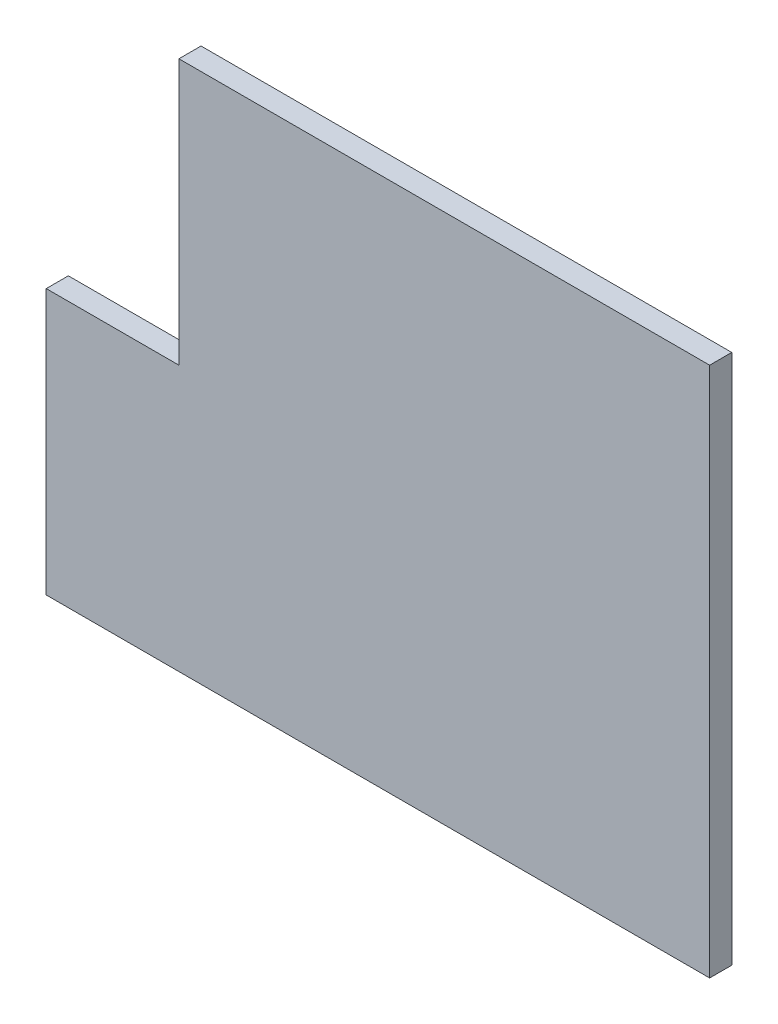
ISO-10303-21;
HEADER;
FILE_DESCRIPTION(('STEP AP214'),'2;1');
FILE_NAME('part.step','',(''),(''),'','','');
FILE_SCHEMA(('AUTOMOTIVE_DESIGN { 1 0 10303 214 1 1 1 1 }'));
ENDSEC;
DATA;
#1=APPLICATION_CONTEXT('core data for automotive mechanical design processes');
#2=APPLICATION_PROTOCOL_DEFINITION('international standard','automotive_design',2000,#1);
#3=PRODUCT_CONTEXT('',#1,'mechanical');
#4=PRODUCT('Part','Part','',(#3));
#5=PRODUCT_RELATED_PRODUCT_CATEGORY('part','',(#4));
#6=PRODUCT_DEFINITION_FORMATION('','',#4);
#7=PRODUCT_DEFINITION_CONTEXT('part definition',#1,'design');
#8=PRODUCT_DEFINITION('design','',#6,#7);
#9=PRODUCT_DEFINITION_SHAPE('','',#8);
#10=(LENGTH_UNIT() NAMED_UNIT(*) SI_UNIT(.MILLI.,.METRE.));
#11=(NAMED_UNIT(*) PLANE_ANGLE_UNIT() SI_UNIT($,.RADIAN.));
#12=(NAMED_UNIT(*) SI_UNIT($,.STERADIAN.) SOLID_ANGLE_UNIT());
#13=UNCERTAINTY_MEASURE_WITH_UNIT(LENGTH_MEASURE(1.E-05),#10,'distance_accuracy_value','');
#14=(GEOMETRIC_REPRESENTATION_CONTEXT(3) GLOBAL_UNCERTAINTY_ASSIGNED_CONTEXT((#13)) GLOBAL_UNIT_ASSIGNED_CONTEXT((#10,
#11,#12)) REPRESENTATION_CONTEXT('',''));
#15=CARTESIAN_POINT('',(0.,0.,0.));
#16=DIRECTION('',(0.,0.,1.));
#17=DIRECTION('',(1.,0.,0.));
#18=AXIS2_PLACEMENT_3D('',#15,#16,#17);
#19=CARTESIAN_POINT('',(47.625,-38.1,1.5875));
#20=DIRECTION('',(-1.,0.,0.));
#21=DIRECTION('',(0.,0.,1.));
#22=AXIS2_PLACEMENT_3D('',#19,#20,#21);
#23=PLANE('',#22);
#24=DIRECTION('',(0.,1.,0.));
#25=VECTOR('',#24,1.);
#26=CARTESIAN_POINT('',(47.625,-38.1,-1.5875));
#27=LINE('',#26,#25);
#28=CARTESIAN_POINT('',(47.625,-38.1,-1.5875));
#29=VERTEX_POINT('',#28);
#30=CARTESIAN_POINT('',(47.625,38.1,-1.5875));
#31=VERTEX_POINT('',#30);
#32=EDGE_CURVE('E134',#29,#31,#27,.T.);
#33=ORIENTED_EDGE('',*,*,#32,.T.);
#34=DIRECTION('',(0.,0.,-1.));
#35=VECTOR('',#34,1.);
#36=CARTESIAN_POINT('',(47.625,38.1,1.5875));
#37=LINE('',#36,#35);
#38=CARTESIAN_POINT('',(47.625,38.1,1.5875));
#39=VERTEX_POINT('',#38);
#40=EDGE_CURVE('E11',#39,#31,#37,.T.);
#41=ORIENTED_EDGE('',*,*,#40,.F.);
#42=DIRECTION('',(0.,1.,0.));
#43=VECTOR('',#42,1.);
#44=CARTESIAN_POINT('',(47.625,-38.1,1.5875));
#45=LINE('',#44,#43);
#46=CARTESIAN_POINT('',(47.625,-38.1,1.5875));
#47=VERTEX_POINT('',#46);
#48=EDGE_CURVE('E136',#47,#39,#45,.T.);
#49=ORIENTED_EDGE('',*,*,#48,.F.);
#50=DIRECTION('',(0.,0.,-1.));
#51=VECTOR('',#50,1.);
#52=CARTESIAN_POINT('',(47.625,-38.1,1.5875));
#53=LINE('',#52,#51);
#54=EDGE_CURVE('E144',#47,#29,#53,.T.);
#55=ORIENTED_EDGE('',*,*,#54,.T.);
#56=EDGE_LOOP('',(#33,#41,#49,#55));
#57=FACE_BOUND('',#56,.T.);
#58=ADVANCED_FACE('F40',(#57),#23,.F.);
#59=CARTESIAN_POINT('',(-47.625,38.1,1.5875));
#60=DIRECTION('',(0.,-1.,0.));
#61=DIRECTION('',(0.,0.,-1.));
#62=AXIS2_PLACEMENT_3D('',#59,#60,#61);
#63=PLANE('',#62);
#64=DIRECTION('',(-1.,0.,0.));
#65=VECTOR('',#64,1.);
#66=CARTESIAN_POINT('',(-47.625,38.1,-1.5875));
#67=LINE('',#66,#65);
#68=CARTESIAN_POINT('',(-28.575,38.1,-1.5875));
#69=VERTEX_POINT('',#68);
#70=EDGE_CURVE('E147',#31,#69,#67,.T.);
#71=ORIENTED_EDGE('',*,*,#70,.T.);
#72=DIRECTION('',(0.,0.,1.));
#73=VECTOR('',#72,1.);
#74=CARTESIAN_POINT('',(-28.575,38.1,-1.5875));
#75=LINE('',#74,#73);
#76=CARTESIAN_POINT('',(-28.575,38.1,1.5875));
#77=VERTEX_POINT('',#76);
#78=EDGE_CURVE('E114',#69,#77,#75,.T.);
#79=ORIENTED_EDGE('',*,*,#78,.T.);
#80=DIRECTION('',(-1.,0.,0.));
#81=VECTOR('',#80,1.);
#82=CARTESIAN_POINT('',(-47.625,38.1,1.5875));
#83=LINE('',#82,#81);
#84=EDGE_CURVE('E86',#39,#77,#83,.T.);
#85=ORIENTED_EDGE('',*,*,#84,.F.);
#86=ORIENTED_EDGE('',*,*,#40,.T.);
#87=EDGE_LOOP('',(#71,#79,#85,#86));
#88=FACE_BOUND('',#87,.T.);
#89=ADVANCED_FACE('F163',(#88),#63,.F.);
#90=CARTESIAN_POINT('',(-47.625,-38.1,1.5875));
#91=DIRECTION('',(1.,0.,0.));
#92=DIRECTION('',(0.,0.,-1.));
#93=AXIS2_PLACEMENT_3D('',#90,#91,#92);
#94=PLANE('',#93);
#95=DIRECTION('',(0.,-1.,0.));
#96=VECTOR('',#95,1.);
#97=CARTESIAN_POINT('',(-47.625,-38.1,1.5875));
#98=LINE('',#97,#96);
#99=CARTESIAN_POINT('',(-47.625,0.,1.5875));
#100=VERTEX_POINT('',#99);
#101=CARTESIAN_POINT('',(-47.625,-38.1,1.5875));
#102=VERTEX_POINT('',#101);
#103=EDGE_CURVE('E139',#100,#102,#98,.T.);
#104=ORIENTED_EDGE('',*,*,#103,.F.);
#105=DIRECTION('',(0.,0.,1.));
#106=VECTOR('',#105,1.);
#107=CARTESIAN_POINT('',(-47.625,0.,-1.5875));
#108=LINE('',#107,#106);
#109=CARTESIAN_POINT('',(-47.625,0.,-1.5875));
#110=VERTEX_POINT('',#109);
#111=EDGE_CURVE('E132',#110,#100,#108,.T.);
#112=ORIENTED_EDGE('',*,*,#111,.F.);
#113=DIRECTION('',(0.,-1.,0.));
#114=VECTOR('',#113,1.);
#115=CARTESIAN_POINT('',(-47.625,-38.1,-1.5875));
#116=LINE('',#115,#114);
#117=CARTESIAN_POINT('',(-47.625,-38.1,-1.5875));
#118=VERTEX_POINT('',#117);
#119=EDGE_CURVE('E122',#110,#118,#116,.T.);
#120=ORIENTED_EDGE('',*,*,#119,.T.);
#121=DIRECTION('',(0.,0.,-1.));
#122=VECTOR('',#121,1.);
#123=CARTESIAN_POINT('',(-47.625,-38.1,1.5875));
#124=LINE('',#123,#122);
#125=EDGE_CURVE('E47',#102,#118,#124,.T.);
#126=ORIENTED_EDGE('',*,*,#125,.F.);
#127=EDGE_LOOP('',(#104,#112,#120,#126));
#128=FACE_BOUND('',#127,.T.);
#129=ADVANCED_FACE('F159',(#128),#94,.F.);
#130=CARTESIAN_POINT('',(-47.625,-38.1,1.5875));
#131=DIRECTION('',(0.,1.,0.));
#132=DIRECTION('',(0.,0.,1.));
#133=AXIS2_PLACEMENT_3D('',#130,#131,#132);
#134=PLANE('',#133);
#135=DIRECTION('',(1.,0.,0.));
#136=VECTOR('',#135,1.);
#137=CARTESIAN_POINT('',(-47.625,-38.1,-1.5875));
#138=LINE('',#137,#136);
#139=EDGE_CURVE('E80',#118,#29,#138,.T.);
#140=ORIENTED_EDGE('',*,*,#139,.T.);
#141=ORIENTED_EDGE('',*,*,#54,.F.);
#142=DIRECTION('',(1.,0.,0.));
#143=VECTOR('',#142,1.);
#144=CARTESIAN_POINT('',(-47.625,-38.1,1.5875));
#145=LINE('',#144,#143);
#146=EDGE_CURVE('E63',#102,#47,#145,.T.);
#147=ORIENTED_EDGE('',*,*,#146,.F.);
#148=ORIENTED_EDGE('',*,*,#125,.T.);
#149=EDGE_LOOP('',(#140,#141,#147,#148));
#150=FACE_BOUND('',#149,.T.);
#151=ADVANCED_FACE('F156',(#150),#134,.F.);
#152=CARTESIAN_POINT('',(0.,0.,1.5875));
#153=DIRECTION('',(0.,0.,-1.));
#154=DIRECTION('',(-1.,0.,0.));
#155=AXIS2_PLACEMENT_3D('',#152,#153,#154);
#156=PLANE('',#155);
#157=DIRECTION('',(0.,1.,0.));
#158=VECTOR('',#157,1.);
#159=CARTESIAN_POINT('',(-28.575,0.,1.5875));
#160=LINE('',#159,#158);
#161=CARTESIAN_POINT('',(-28.575,0.,1.5875));
#162=VERTEX_POINT('',#161);
#163=EDGE_CURVE('E125',#162,#77,#160,.T.);
#164=ORIENTED_EDGE('',*,*,#163,.F.);
#165=DIRECTION('',(1.,0.,0.));
#166=VECTOR('',#165,1.);
#167=CARTESIAN_POINT('',(0.,0.,1.5875));
#168=LINE('',#167,#166);
#169=EDGE_CURVE('E110',#100,#162,#168,.T.);
#170=ORIENTED_EDGE('',*,*,#169,.F.);
#171=ORIENTED_EDGE('',*,*,#103,.T.);
#172=ORIENTED_EDGE('',*,*,#146,.T.);
#173=ORIENTED_EDGE('',*,*,#48,.T.);
#174=ORIENTED_EDGE('',*,*,#84,.T.);
#175=EDGE_LOOP('',(#164,#170,#171,#172,#173,#174));
#176=FACE_BOUND('',#175,.T.);
#177=ADVANCED_FACE('F160',(#176),#156,.F.);
#178=CARTESIAN_POINT('',(0.,0.,-1.5875));
#179=DIRECTION('',(0.,0.,-1.));
#180=DIRECTION('',(-1.,0.,0.));
#181=AXIS2_PLACEMENT_3D('',#178,#179,#180);
#182=PLANE('',#181);
#183=DIRECTION('',(1.,0.,0.));
#184=VECTOR('',#183,1.);
#185=CARTESIAN_POINT('',(0.,0.,-1.5875));
#186=LINE('',#185,#184);
#187=CARTESIAN_POINT('',(-28.575,0.,-1.5875));
#188=VERTEX_POINT('',#187);
#189=EDGE_CURVE('E108',#110,#188,#186,.T.);
#190=ORIENTED_EDGE('',*,*,#189,.T.);
#191=DIRECTION('',(0.,1.,0.));
#192=VECTOR('',#191,1.);
#193=CARTESIAN_POINT('',(-28.575,0.,-1.5875));
#194=LINE('',#193,#192);
#195=EDGE_CURVE('E54',#188,#69,#194,.T.);
#196=ORIENTED_EDGE('',*,*,#195,.T.);
#197=ORIENTED_EDGE('',*,*,#70,.F.);
#198=ORIENTED_EDGE('',*,*,#32,.F.);
#199=ORIENTED_EDGE('',*,*,#139,.F.);
#200=ORIENTED_EDGE('',*,*,#119,.F.);
#201=EDGE_LOOP('',(#190,#196,#197,#198,#199,#200));
#202=FACE_BOUND('',#201,.T.);
#203=ADVANCED_FACE('F120',(#202),#182,.T.);
#204=CARTESIAN_POINT('',(0.,0.,-1.5875));
#205=DIRECTION('',(0.,-1.,0.));
#206=DIRECTION('',(1.,0.,0.));
#207=AXIS2_PLACEMENT_3D('',#204,#205,#206);
#208=PLANE('',#207);
#209=ORIENTED_EDGE('',*,*,#169,.T.);
#210=DIRECTION('',(0.,0.,1.));
#211=VECTOR('',#210,1.);
#212=CARTESIAN_POINT('',(-28.575,0.,-1.5875));
#213=LINE('',#212,#211);
#214=EDGE_CURVE('E105',#188,#162,#213,.T.);
#215=ORIENTED_EDGE('',*,*,#214,.F.);
#216=ORIENTED_EDGE('',*,*,#189,.F.);
#217=ORIENTED_EDGE('',*,*,#111,.T.);
#218=EDGE_LOOP('',(#209,#215,#216,#217));
#219=FACE_BOUND('',#218,.T.);
#220=ADVANCED_FACE('F106',(#219),#208,.F.);
#221=CARTESIAN_POINT('',(-28.575,0.,-1.5875));
#222=DIRECTION('',(1.,0.,0.));
#223=DIRECTION('',(0.,1.,0.));
#224=AXIS2_PLACEMENT_3D('',#221,#222,#223);
#225=PLANE('',#224);
#226=ORIENTED_EDGE('',*,*,#163,.T.);
#227=ORIENTED_EDGE('',*,*,#78,.F.);
#228=ORIENTED_EDGE('',*,*,#195,.F.);
#229=ORIENTED_EDGE('',*,*,#214,.T.);
#230=EDGE_LOOP('',(#226,#227,#228,#229));
#231=FACE_BOUND('',#230,.T.);
#232=ADVANCED_FACE('F116',(#231),#225,.F.);
#233=CLOSED_SHELL('',(#58,#89,#129,#151,#177,#203,#220,#232));
#234=MANIFOLD_SOLID_BREP('B2',#233);
#235=ADVANCED_BREP_SHAPE_REPRESENTATION('',(#18,#234),#14);
#236=SHAPE_DEFINITION_REPRESENTATION(#9,#235);
ENDSEC;
END-ISO-10303-21;
